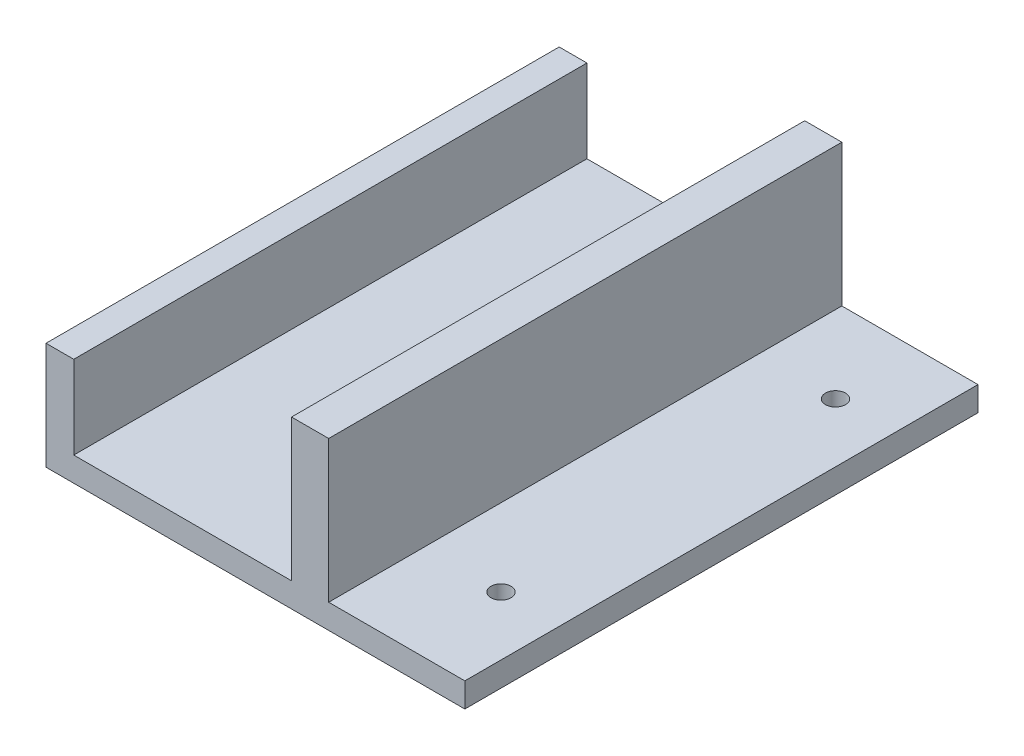
ISO-10303-21;
HEADER;
FILE_DESCRIPTION(('STEP AP214'),'2;1');
FILE_NAME('part.step','',(''),(''),'','','');
FILE_SCHEMA(('AUTOMOTIVE_DESIGN { 1 0 10303 214 1 1 1 1 }'));
ENDSEC;
DATA;
#1=APPLICATION_CONTEXT('core data for automotive mechanical design processes');
#2=APPLICATION_PROTOCOL_DEFINITION('international standard','automotive_design',2000,#1);
#3=PRODUCT_CONTEXT('',#1,'mechanical');
#4=PRODUCT('Part','Part','',(#3));
#5=PRODUCT_RELATED_PRODUCT_CATEGORY('part','',(#4));
#6=PRODUCT_DEFINITION_FORMATION('','',#4);
#7=PRODUCT_DEFINITION_CONTEXT('part definition',#1,'design');
#8=PRODUCT_DEFINITION('design','',#6,#7);
#9=PRODUCT_DEFINITION_SHAPE('','',#8);
#10=(LENGTH_UNIT() NAMED_UNIT(*) SI_UNIT(.MILLI.,.METRE.));
#11=(NAMED_UNIT(*) PLANE_ANGLE_UNIT() SI_UNIT($,.RADIAN.));
#12=(NAMED_UNIT(*) SI_UNIT($,.STERADIAN.) SOLID_ANGLE_UNIT());
#13=UNCERTAINTY_MEASURE_WITH_UNIT(LENGTH_MEASURE(1.E-05),#10,'distance_accuracy_value','');
#14=(GEOMETRIC_REPRESENTATION_CONTEXT(3) GLOBAL_UNCERTAINTY_ASSIGNED_CONTEXT((#13)) GLOBAL_UNIT_ASSIGNED_CONTEXT((#10,
#11,#12)) REPRESENTATION_CONTEXT('',''));
#15=CARTESIAN_POINT('',(0.,0.,0.));
#16=DIRECTION('',(0.,0.,1.));
#17=DIRECTION('',(1.,0.,0.));
#18=AXIS2_PLACEMENT_3D('',#15,#16,#17);
#19=CARTESIAN_POINT('',(-54.3,0.,153.4));
#20=DIRECTION('',(1.,0.,0.));
#21=DIRECTION('',(0.,0.,-1.));
#22=AXIS2_PLACEMENT_3D('',#19,#20,#21);
#23=PLANE('',#22);
#24=DIRECTION('',(0.,-1.,0.));
#25=VECTOR('',#24,1.);
#26=CARTESIAN_POINT('',(-54.3,0.,0.));
#27=LINE('',#26,#25);
#28=CARTESIAN_POINT('',(-54.3,28.45,0.));
#29=VERTEX_POINT('',#28);
#30=CARTESIAN_POINT('',(-54.3,3.65,0.));
#31=VERTEX_POINT('',#30);
#32=EDGE_CURVE('E142',#29,#31,#27,.T.);
#33=ORIENTED_EDGE('',*,*,#32,.F.);
#34=DIRECTION('',(0.,0.,-1.));
#35=VECTOR('',#34,1.);
#36=CARTESIAN_POINT('',(-54.3,28.45,153.4));
#37=LINE('',#36,#35);
#38=CARTESIAN_POINT('',(-54.3,28.45,153.4));
#39=VERTEX_POINT('',#38);
#40=EDGE_CURVE('E11',#39,#29,#37,.T.);
#41=ORIENTED_EDGE('',*,*,#40,.F.);
#42=DIRECTION('',(0.,-1.,0.));
#43=VECTOR('',#42,1.);
#44=CARTESIAN_POINT('',(-54.3,0.,153.4));
#45=LINE('',#44,#43);
#46=CARTESIAN_POINT('',(-54.3,3.65,153.4));
#47=VERTEX_POINT('',#46);
#48=EDGE_CURVE('E202',#39,#47,#45,.T.);
#49=ORIENTED_EDGE('',*,*,#48,.T.);
#50=DIRECTION('',(0.,0.,-1.));
#51=VECTOR('',#50,1.);
#52=CARTESIAN_POINT('',(-54.3,3.65,153.4));
#53=LINE('',#52,#51);
#54=EDGE_CURVE('E51',#47,#31,#53,.T.);
#55=ORIENTED_EDGE('',*,*,#54,.T.);
#56=EDGE_LOOP('',(#33,#41,#49,#55));
#57=FACE_BOUND('',#56,.T.);
#58=ADVANCED_FACE('F35',(#57),#23,.T.);
#59=CARTESIAN_POINT('',(0.,28.45,153.4));
#60=DIRECTION('',(0.,1.,0.));
#61=DIRECTION('',(0.,0.,1.));
#62=AXIS2_PLACEMENT_3D('',#59,#60,#61);
#63=PLANE('',#62);
#64=DIRECTION('',(1.,0.,0.));
#65=VECTOR('',#64,1.);
#66=CARTESIAN_POINT('',(0.,28.45,0.));
#67=LINE('',#66,#65);
#68=CARTESIAN_POINT('',(-62.6,28.45,0.));
#69=VERTEX_POINT('',#68);
#70=EDGE_CURVE('E144',#69,#29,#67,.T.);
#71=ORIENTED_EDGE('',*,*,#70,.F.);
#72=DIRECTION('',(0.,0.,-1.));
#73=VECTOR('',#72,1.);
#74=CARTESIAN_POINT('',(-62.6,28.45,153.4));
#75=LINE('',#74,#73);
#76=CARTESIAN_POINT('',(-62.6,28.45,153.4));
#77=VERTEX_POINT('',#76);
#78=EDGE_CURVE('E43',#77,#69,#75,.T.);
#79=ORIENTED_EDGE('',*,*,#78,.F.);
#80=DIRECTION('',(1.,0.,0.));
#81=VECTOR('',#80,1.);
#82=CARTESIAN_POINT('',(0.,28.45,153.4));
#83=LINE('',#82,#81);
#84=EDGE_CURVE('E200',#77,#39,#83,.T.);
#85=ORIENTED_EDGE('',*,*,#84,.T.);
#86=ORIENTED_EDGE('',*,*,#40,.T.);
#87=EDGE_LOOP('',(#71,#79,#85,#86));
#88=FACE_BOUND('',#87,.T.);
#89=ADVANCED_FACE('F186',(#88),#63,.T.);
#90=CARTESIAN_POINT('',(-62.6,0.,153.4));
#91=DIRECTION('',(-1.,0.,0.));
#92=DIRECTION('',(0.,0.,1.));
#93=AXIS2_PLACEMENT_3D('',#90,#91,#92);
#94=PLANE('',#93);
#95=DIRECTION('',(0.,1.,0.));
#96=VECTOR('',#95,1.);
#97=CARTESIAN_POINT('',(-62.6,0.,0.));
#98=LINE('',#97,#96);
#99=CARTESIAN_POINT('',(-62.6,-3.65,0.));
#100=VERTEX_POINT('',#99);
#101=EDGE_CURVE('E148',#100,#69,#98,.T.);
#102=ORIENTED_EDGE('',*,*,#101,.F.);
#103=DIRECTION('',(0.,0.,-1.));
#104=VECTOR('',#103,1.);
#105=CARTESIAN_POINT('',(-62.6,-3.65,153.4));
#106=LINE('',#105,#104);
#107=CARTESIAN_POINT('',(-62.6,-3.65,153.4));
#108=VERTEX_POINT('',#107);
#109=EDGE_CURVE('E175',#108,#100,#106,.T.);
#110=ORIENTED_EDGE('',*,*,#109,.F.);
#111=DIRECTION('',(0.,1.,0.));
#112=VECTOR('',#111,1.);
#113=CARTESIAN_POINT('',(-62.6,0.,153.4));
#114=LINE('',#113,#112);
#115=EDGE_CURVE('E182',#108,#77,#114,.T.);
#116=ORIENTED_EDGE('',*,*,#115,.T.);
#117=ORIENTED_EDGE('',*,*,#78,.T.);
#118=EDGE_LOOP('',(#102,#110,#116,#117));
#119=FACE_BOUND('',#118,.T.);
#120=ADVANCED_FACE('F180',(#119),#94,.T.);
#121=CARTESIAN_POINT('',(0.,-3.65,153.4));
#122=DIRECTION('',(0.,1.,0.));
#123=DIRECTION('',(0.,0.,1.));
#124=AXIS2_PLACEMENT_3D('',#121,#122,#123);
#125=PLANE('',#124);
#126=CARTESIAN_POINT('',(45.,-3.64999999999999,125.));
#127=DIRECTION('',(0.,1.,0.));
#128=DIRECTION('',(0.,0.,1.));
#129=AXIS2_PLACEMENT_3D('',#126,#127,#128);
#130=CIRCLE('',#129,3.);
#131=CARTESIAN_POINT('',(45.,-3.64999999999999,128.));
#132=VERTEX_POINT('',#131);
#133=EDGE_CURVE('E237',#132,#132,#130,.T.);
#134=ORIENTED_EDGE('',*,*,#133,.T.);
#135=EDGE_LOOP('',(#134));
#136=FACE_BOUND('',#135,.T.);
#137=CARTESIAN_POINT('',(45.,-3.64999999999999,25.));
#138=DIRECTION('',(0.,1.,0.));
#139=DIRECTION('',(0.,0.,1.));
#140=AXIS2_PLACEMENT_3D('',#137,#138,#139);
#141=CIRCLE('',#140,3.);
#142=CARTESIAN_POINT('',(45.,-3.64999999999999,28.));
#143=VERTEX_POINT('',#142);
#144=EDGE_CURVE('E145',#143,#143,#141,.T.);
#145=ORIENTED_EDGE('',*,*,#144,.T.);
#146=EDGE_LOOP('',(#145));
#147=FACE_BOUND('',#146,.T.);
#148=DIRECTION('',(1.,0.,0.));
#149=VECTOR('',#148,1.);
#150=CARTESIAN_POINT('',(0.,-3.65,0.));
#151=LINE('',#150,#149);
#152=CARTESIAN_POINT('',(62.6,-3.65,0.));
#153=VERTEX_POINT('',#152);
#154=EDGE_CURVE('E151',#100,#153,#151,.T.);
#155=ORIENTED_EDGE('',*,*,#154,.T.);
#156=DIRECTION('',(0.,0.,-1.));
#157=VECTOR('',#156,1.);
#158=CARTESIAN_POINT('',(62.6,-3.65,153.4));
#159=LINE('',#158,#157);
#160=CARTESIAN_POINT('',(62.6,-3.65,153.4));
#161=VERTEX_POINT('',#160);
#162=EDGE_CURVE('E173',#161,#153,#159,.T.);
#163=ORIENTED_EDGE('',*,*,#162,.F.);
#164=DIRECTION('',(1.,0.,0.));
#165=VECTOR('',#164,1.);
#166=CARTESIAN_POINT('',(0.,-3.65,153.4));
#167=LINE('',#166,#165);
#168=EDGE_CURVE('E196',#108,#161,#167,.T.);
#169=ORIENTED_EDGE('',*,*,#168,.F.);
#170=ORIENTED_EDGE('',*,*,#109,.T.);
#171=EDGE_LOOP('',(#155,#163,#169,#170));
#172=FACE_BOUND('',#171,.T.);
#173=ADVANCED_FACE('F193',(#136,#147,#172),#125,.F.);
#174=CARTESIAN_POINT('',(62.6,0.,153.4));
#175=DIRECTION('',(1.,0.,0.));
#176=DIRECTION('',(0.,0.,-1.));
#177=AXIS2_PLACEMENT_3D('',#174,#175,#176);
#178=PLANE('',#177);
#179=DIRECTION('',(0.,-1.,0.));
#180=VECTOR('',#179,1.);
#181=CARTESIAN_POINT('',(62.6,0.,0.));
#182=LINE('',#181,#180);
#183=CARTESIAN_POINT('',(62.6,3.65,0.));
#184=VERTEX_POINT('',#183);
#185=EDGE_CURVE('E154',#184,#153,#182,.T.);
#186=ORIENTED_EDGE('',*,*,#185,.F.);
#187=DIRECTION('',(0.,0.,-1.));
#188=VECTOR('',#187,1.);
#189=CARTESIAN_POINT('',(62.6,3.65,153.4));
#190=LINE('',#189,#188);
#191=CARTESIAN_POINT('',(62.6,3.65,153.4));
#192=VERTEX_POINT('',#191);
#193=EDGE_CURVE('E171',#192,#184,#190,.T.);
#194=ORIENTED_EDGE('',*,*,#193,.F.);
#195=DIRECTION('',(0.,-1.,0.));
#196=VECTOR('',#195,1.);
#197=CARTESIAN_POINT('',(62.6,0.,153.4));
#198=LINE('',#197,#196);
#199=EDGE_CURVE('E198',#192,#161,#198,.T.);
#200=ORIENTED_EDGE('',*,*,#199,.T.);
#201=ORIENTED_EDGE('',*,*,#162,.T.);
#202=EDGE_LOOP('',(#186,#194,#200,#201));
#203=FACE_BOUND('',#202,.T.);
#204=ADVANCED_FACE('F211',(#203),#178,.T.);
#205=CARTESIAN_POINT('',(0.,3.65,153.4));
#206=DIRECTION('',(0.,1.,0.));
#207=DIRECTION('',(0.,0.,1.));
#208=AXIS2_PLACEMENT_3D('',#205,#206,#207);
#209=PLANE('',#208);
#210=CARTESIAN_POINT('',(45.,3.65,125.));
#211=DIRECTION('',(0.,1.,0.));
#212=DIRECTION('',(0.,0.,1.));
#213=AXIS2_PLACEMENT_3D('',#210,#211,#212);
#214=CIRCLE('',#213,3.);
#215=CARTESIAN_POINT('',(45.,3.65,128.));
#216=VERTEX_POINT('',#215);
#217=EDGE_CURVE('E240',#216,#216,#214,.T.);
#218=ORIENTED_EDGE('',*,*,#217,.F.);
#219=EDGE_LOOP('',(#218));
#220=FACE_BOUND('',#219,.T.);
#221=CARTESIAN_POINT('',(45.,3.65,25.));
#222=DIRECTION('',(0.,1.,0.));
#223=DIRECTION('',(0.,0.,1.));
#224=AXIS2_PLACEMENT_3D('',#221,#222,#223);
#225=CIRCLE('',#224,3.);
#226=CARTESIAN_POINT('',(45.,3.65,28.));
#227=VERTEX_POINT('',#226);
#228=EDGE_CURVE('E234',#227,#227,#225,.T.);
#229=ORIENTED_EDGE('',*,*,#228,.F.);
#230=EDGE_LOOP('',(#229));
#231=FACE_BOUND('',#230,.T.);
#232=DIRECTION('',(1.,0.,0.));
#233=VECTOR('',#232,1.);
#234=CARTESIAN_POINT('',(0.,3.65,0.));
#235=LINE('',#234,#233);
#236=CARTESIAN_POINT('',(21.9,3.65,0.));
#237=VERTEX_POINT('',#236);
#238=EDGE_CURVE('E157',#237,#184,#235,.T.);
#239=ORIENTED_EDGE('',*,*,#238,.F.);
#240=DIRECTION('',(0.,0.,-1.));
#241=VECTOR('',#240,1.);
#242=CARTESIAN_POINT('',(21.9,3.65,153.4));
#243=LINE('',#242,#241);
#244=CARTESIAN_POINT('',(21.9,3.65,153.4));
#245=VERTEX_POINT('',#244);
#246=EDGE_CURVE('E169',#245,#237,#243,.T.);
#247=ORIENTED_EDGE('',*,*,#246,.F.);
#248=DIRECTION('',(1.,0.,0.));
#249=VECTOR('',#248,1.);
#250=CARTESIAN_POINT('',(0.,3.65,153.4));
#251=LINE('',#250,#249);
#252=EDGE_CURVE('E139',#245,#192,#251,.T.);
#253=ORIENTED_EDGE('',*,*,#252,.T.);
#254=ORIENTED_EDGE('',*,*,#193,.T.);
#255=EDGE_LOOP('',(#239,#247,#253,#254));
#256=FACE_BOUND('',#255,.T.);
#257=ADVANCED_FACE('F209',(#220,#231,#256),#209,.T.);
#258=CARTESIAN_POINT('',(21.9,0.,153.4));
#259=DIRECTION('',(-1.,0.,0.));
#260=DIRECTION('',(0.,-1.,0.));
#261=AXIS2_PLACEMENT_3D('',#258,#259,#260);
#262=PLANE('',#261);
#263=DIRECTION('',(0.,1.,0.));
#264=VECTOR('',#263,1.);
#265=CARTESIAN_POINT('',(21.9,0.,0.));
#266=LINE('',#265,#264);
#267=CARTESIAN_POINT('',(21.9,46.05,0.));
#268=VERTEX_POINT('',#267);
#269=EDGE_CURVE('E160',#237,#268,#266,.T.);
#270=ORIENTED_EDGE('',*,*,#269,.T.);
#271=DIRECTION('',(0.,0.,-1.));
#272=VECTOR('',#271,1.);
#273=CARTESIAN_POINT('',(21.9,46.05,153.4));
#274=LINE('',#273,#272);
#275=CARTESIAN_POINT('',(21.9,46.05,153.4));
#276=VERTEX_POINT('',#275);
#277=EDGE_CURVE('E133',#276,#268,#274,.T.);
#278=ORIENTED_EDGE('',*,*,#277,.F.);
#279=DIRECTION('',(0.,1.,0.));
#280=VECTOR('',#279,1.);
#281=CARTESIAN_POINT('',(21.9,0.,153.4));
#282=LINE('',#281,#280);
#283=EDGE_CURVE('E121',#245,#276,#282,.T.);
#284=ORIENTED_EDGE('',*,*,#283,.F.);
#285=ORIENTED_EDGE('',*,*,#246,.T.);
#286=EDGE_LOOP('',(#270,#278,#284,#285));
#287=FACE_BOUND('',#286,.T.);
#288=ADVANCED_FACE('F214',(#287),#262,.F.);
#289=CARTESIAN_POINT('',(0.,46.05,153.4));
#290=DIRECTION('',(0.,-1.,0.));
#291=DIRECTION('',(0.,0.,-1.));
#292=AXIS2_PLACEMENT_3D('',#289,#290,#291);
#293=PLANE('',#292);
#294=DIRECTION('',(-1.,0.,0.));
#295=VECTOR('',#294,1.);
#296=CARTESIAN_POINT('',(0.,46.05,0.));
#297=LINE('',#296,#295);
#298=CARTESIAN_POINT('',(10.8,46.05,0.));
#299=VERTEX_POINT('',#298);
#300=EDGE_CURVE('E130',#268,#299,#297,.T.);
#301=ORIENTED_EDGE('',*,*,#300,.T.);
#302=DIRECTION('',(0.,0.,-1.));
#303=VECTOR('',#302,1.);
#304=CARTESIAN_POINT('',(10.8,46.05,153.4));
#305=LINE('',#304,#303);
#306=CARTESIAN_POINT('',(10.8,46.05,153.4));
#307=VERTEX_POINT('',#306);
#308=EDGE_CURVE('E127',#307,#299,#305,.T.);
#309=ORIENTED_EDGE('',*,*,#308,.F.);
#310=DIRECTION('',(-1.,0.,0.));
#311=VECTOR('',#310,1.);
#312=CARTESIAN_POINT('',(0.,46.05,153.4));
#313=LINE('',#312,#311);
#314=EDGE_CURVE('E113',#276,#307,#313,.T.);
#315=ORIENTED_EDGE('',*,*,#314,.F.);
#316=ORIENTED_EDGE('',*,*,#277,.T.);
#317=EDGE_LOOP('',(#301,#309,#315,#316));
#318=FACE_BOUND('',#317,.T.);
#319=ADVANCED_FACE('F128',(#318),#293,.F.);
#320=CARTESIAN_POINT('',(10.8,0.,153.4));
#321=DIRECTION('',(1.,0.,0.));
#322=DIRECTION('',(0.,1.,0.));
#323=AXIS2_PLACEMENT_3D('',#320,#321,#322);
#324=PLANE('',#323);
#325=DIRECTION('',(0.,-1.,0.));
#326=VECTOR('',#325,1.);
#327=CARTESIAN_POINT('',(10.8,0.,0.));
#328=LINE('',#327,#326);
#329=CARTESIAN_POINT('',(10.8,3.65,0.));
#330=VERTEX_POINT('',#329);
#331=EDGE_CURVE('E164',#299,#330,#328,.T.);
#332=ORIENTED_EDGE('',*,*,#331,.T.);
#333=DIRECTION('',(0.,0.,-1.));
#334=VECTOR('',#333,1.);
#335=CARTESIAN_POINT('',(10.8,3.65,153.4));
#336=LINE('',#335,#334);
#337=CARTESIAN_POINT('',(10.8,3.65,153.4));
#338=VERTEX_POINT('',#337);
#339=EDGE_CURVE('E83',#338,#330,#336,.T.);
#340=ORIENTED_EDGE('',*,*,#339,.F.);
#341=DIRECTION('',(0.,-1.,0.));
#342=VECTOR('',#341,1.);
#343=CARTESIAN_POINT('',(10.8,0.,153.4));
#344=LINE('',#343,#342);
#345=EDGE_CURVE('E118',#307,#338,#344,.T.);
#346=ORIENTED_EDGE('',*,*,#345,.F.);
#347=ORIENTED_EDGE('',*,*,#308,.T.);
#348=EDGE_LOOP('',(#332,#340,#346,#347));
#349=FACE_BOUND('',#348,.T.);
#350=ADVANCED_FACE('F135',(#349),#324,.F.);
#351=EDGE_CURVE('E161',#31,#330,#235,.T.);
#352=ORIENTED_EDGE('',*,*,#351,.F.);
#353=ORIENTED_EDGE('',*,*,#54,.F.);
#354=EDGE_CURVE('E136',#47,#338,#251,.T.);
#355=ORIENTED_EDGE('',*,*,#354,.T.);
#356=ORIENTED_EDGE('',*,*,#339,.T.);
#357=EDGE_LOOP('',(#352,#353,#355,#356));
#358=FACE_BOUND('',#357,.T.);
#359=ADVANCED_FACE('F224',(#358),#209,.T.);
#360=CARTESIAN_POINT('',(0.,0.,153.4));
#361=DIRECTION('',(0.,0.,1.));
#362=DIRECTION('',(1.,0.,0.));
#363=AXIS2_PLACEMENT_3D('',#360,#361,#362);
#364=PLANE('',#363);
#365=ORIENTED_EDGE('',*,*,#48,.F.);
#366=ORIENTED_EDGE('',*,*,#84,.F.);
#367=ORIENTED_EDGE('',*,*,#115,.F.);
#368=ORIENTED_EDGE('',*,*,#168,.T.);
#369=ORIENTED_EDGE('',*,*,#199,.F.);
#370=ORIENTED_EDGE('',*,*,#252,.F.);
#371=ORIENTED_EDGE('',*,*,#283,.T.);
#372=ORIENTED_EDGE('',*,*,#314,.T.);
#373=ORIENTED_EDGE('',*,*,#345,.T.);
#374=ORIENTED_EDGE('',*,*,#354,.F.);
#375=EDGE_LOOP('',(#365,#366,#367,#368,#369,#370,#371,#372,#373,#374));
#376=FACE_BOUND('',#375,.T.);
#377=ADVANCED_FACE('F115',(#376),#364,.T.);
#378=CARTESIAN_POINT('',(0.,0.,0.));
#379=DIRECTION('',(0.,0.,1.));
#380=DIRECTION('',(1.,0.,0.));
#381=AXIS2_PLACEMENT_3D('',#378,#379,#380);
#382=PLANE('',#381);
#383=ORIENTED_EDGE('',*,*,#32,.T.);
#384=ORIENTED_EDGE('',*,*,#351,.T.);
#385=ORIENTED_EDGE('',*,*,#331,.F.);
#386=ORIENTED_EDGE('',*,*,#300,.F.);
#387=ORIENTED_EDGE('',*,*,#269,.F.);
#388=ORIENTED_EDGE('',*,*,#238,.T.);
#389=ORIENTED_EDGE('',*,*,#185,.T.);
#390=ORIENTED_EDGE('',*,*,#154,.F.);
#391=ORIENTED_EDGE('',*,*,#101,.T.);
#392=ORIENTED_EDGE('',*,*,#70,.T.);
#393=EDGE_LOOP('',(#383,#384,#385,#386,#387,#388,#389,#390,#391,#392));
#394=FACE_BOUND('',#393,.T.);
#395=ADVANCED_FACE('F189',(#394),#382,.F.);
#396=CARTESIAN_POINT('',(45.,-149.75,25.));
#397=DIRECTION('',(0.,1.,0.));
#398=DIRECTION('',(0.,0.,1.));
#399=AXIS2_PLACEMENT_3D('',#396,#397,#398);
#400=CYLINDRICAL_SURFACE('',#399,3.);
#401=ORIENTED_EDGE('',*,*,#228,.T.);
#402=EDGE_LOOP('',(#401));
#403=FACE_BOUND('',#402,.T.);
#404=ORIENTED_EDGE('',*,*,#144,.F.);
#405=EDGE_LOOP('',(#404));
#406=FACE_BOUND('',#405,.T.);
#407=ADVANCED_FACE('F249',(#403,#406),#400,.F.);
#408=CARTESIAN_POINT('',(45.,-149.75,125.));
#409=DIRECTION('',(0.,1.,0.));
#410=DIRECTION('',(0.,0.,1.));
#411=AXIS2_PLACEMENT_3D('',#408,#409,#410);
#412=CYLINDRICAL_SURFACE('',#411,3.);
#413=ORIENTED_EDGE('',*,*,#217,.T.);
#414=EDGE_LOOP('',(#413));
#415=FACE_BOUND('',#414,.T.);
#416=ORIENTED_EDGE('',*,*,#133,.F.);
#417=EDGE_LOOP('',(#416));
#418=FACE_BOUND('',#417,.T.);
#419=ADVANCED_FACE('F244',(#415,#418),#412,.F.);
#420=CLOSED_SHELL('',(#58,#89,#120,#173,#204,#257,#288,#319,#350,#359,#377,#395,#407,#419));
#421=MANIFOLD_SOLID_BREP('B2',#420);
#422=ADVANCED_BREP_SHAPE_REPRESENTATION('',(#18,#421),#14);
#423=SHAPE_DEFINITION_REPRESENTATION(#9,#422);
ENDSEC;
END-ISO-10303-21;
